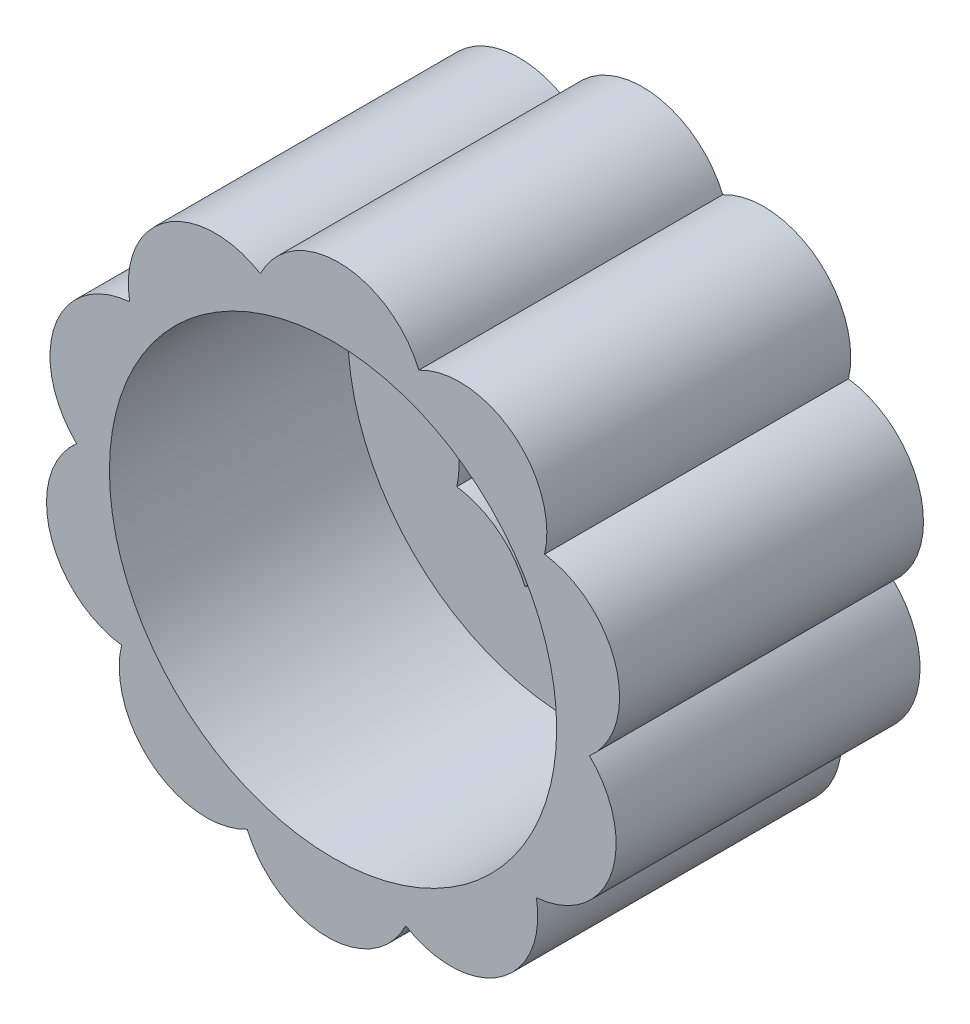
ISO-10303-21;
HEADER;
FILE_DESCRIPTION(('STEP AP214'),'2;1');
FILE_NAME('part.step','',(''),(''),'','','');
FILE_SCHEMA(('AUTOMOTIVE_DESIGN { 1 0 10303 214 1 1 1 1 }'));
ENDSEC;
DATA;
#1=APPLICATION_CONTEXT('core data for automotive mechanical design processes');
#2=APPLICATION_PROTOCOL_DEFINITION('international standard','automotive_design',2000,#1);
#3=PRODUCT_CONTEXT('',#1,'mechanical');
#4=PRODUCT('Part','Part','',(#3));
#5=PRODUCT_RELATED_PRODUCT_CATEGORY('part','',(#4));
#6=PRODUCT_DEFINITION_FORMATION('','',#4);
#7=PRODUCT_DEFINITION_CONTEXT('part definition',#1,'design');
#8=PRODUCT_DEFINITION('design','',#6,#7);
#9=PRODUCT_DEFINITION_SHAPE('','',#8);
#10=(LENGTH_UNIT() NAMED_UNIT(*) SI_UNIT(.MILLI.,.METRE.));
#11=(NAMED_UNIT(*) PLANE_ANGLE_UNIT() SI_UNIT($,.RADIAN.));
#12=(NAMED_UNIT(*) SI_UNIT($,.STERADIAN.) SOLID_ANGLE_UNIT());
#13=UNCERTAINTY_MEASURE_WITH_UNIT(LENGTH_MEASURE(1.E-05),#10,'distance_accuracy_value','');
#14=(GEOMETRIC_REPRESENTATION_CONTEXT(3) GLOBAL_UNCERTAINTY_ASSIGNED_CONTEXT((#13)) GLOBAL_UNIT_ASSIGNED_CONTEXT((#10,
#11,#12)) REPRESENTATION_CONTEXT('',''));
#15=CARTESIAN_POINT('',(0.,0.,0.));
#16=DIRECTION('',(0.,0.,1.));
#17=DIRECTION('',(1.,0.,0.));
#18=AXIS2_PLACEMENT_3D('',#15,#16,#17);
#19=CARTESIAN_POINT('',(18.9480103493997,53.3766191941579,87.));
#20=DIRECTION('',(0.,0.,1.));
#21=DIRECTION('',(1.,0.,0.));
#22=AXIS2_PLACEMENT_3D('',#19,#20,#21);
#23=PLANE('',#22);
#24=CARTESIAN_POINT('',(0.,0.,87.));
#25=DIRECTION('',(0.,0.,1.));
#26=DIRECTION('',(1.,0.,0.));
#27=AXIS2_PLACEMENT_3D('',#24,#25,#26);
#28=CIRCLE('',#27,64.0210741456216);
#29=CARTESIAN_POINT('',(64.0210741456216,0.,87.));
#30=VERTEX_POINT('',#29);
#31=EDGE_CURVE('E41',#30,#30,#28,.T.);
#32=ORIENTED_EDGE('',*,*,#31,.F.);
#33=EDGE_LOOP('',(#32));
#34=FACE_BOUND('',#33,.T.);
#35=CARTESIAN_POINT('',(36.2911252439045,47.2200374272145,87.));
#36=DIRECTION('',(0.,0.,1.));
#37=DIRECTION('',(1.,0.,0.));
#38=AXIS2_PLACEMENT_3D('',#35,#36,#37);
#39=CIRCLE('',#38,24.9163358273113);
#40=CARTESIAN_POINT('',(60.5533730327671,41.5484306627091,87.));
#41=VERTEX_POINT('',#40);
#42=CARTESIAN_POINT('',(24.5671530507992,69.2057661409653,87.));
#43=VERTEX_POINT('',#42);
#44=EDGE_CURVE('E211',#41,#43,#39,.T.);
#45=ORIENTED_EDGE('',*,*,#44,.T.);
#46=CARTESIAN_POINT('',(1.60489545489485,59.5332009611013,87.));
#47=DIRECTION('',(0.,0.,1.));
#48=DIRECTION('',(1.,0.,0.));
#49=AXIS2_PLACEMENT_3D('',#46,#47,#48);
#50=CIRCLE('',#49,24.9163358273119);
#51=CARTESIAN_POINT('',(-20.8028843897529,70.4288511708494,87.));
#52=VERTEX_POINT('',#51);
#53=EDGE_CURVE('E214',#43,#52,#50,.T.);
#54=ORIENTED_EDGE('',*,*,#53,.T.);
#55=CARTESIAN_POINT('',(-33.6943498494944,49.1067051869282,87.));
#56=DIRECTION('',(0.,0.,1.));
#57=DIRECTION('',(1.,0.,0.));
#58=AXIS2_PLACEMENT_3D('',#55,#56,#57);
#59=CIRCLE('',#58,24.9163358273113);
#60=CARTESIAN_POINT('',(-58.2269270574534,44.750508842078,87.));
#61=VERTEX_POINT('',#60);
#62=EDGE_CURVE('E217',#52,#61,#59,.T.);
#63=ORIENTED_EDGE('',*,*,#62,.T.);
#64=CARTESIAN_POINT('',(-56.1234987402054,19.9231171068684,87.));
#65=DIRECTION('',(0.,0.,1.));
#66=DIRECTION('',(1.,0.,0.));
#67=AXIS2_PLACEMENT_3D('',#64,#65,#66);
#68=CIRCLE('',#67,24.9163358273108);
#69=CARTESIAN_POINT('',(-73.4102626496661,1.97899314948605,87.));
#70=VERTEX_POINT('',#69);
#71=EDGE_CURVE('E219',#61,#70,#68,.T.);
#72=ORIENTED_EDGE('',*,*,#71,.T.);
#73=CARTESIAN_POINT('',(-57.115378679719,-16.8704245461701,87.));
#74=DIRECTION('',(0.,0.,1.));
#75=DIRECTION('',(1.,0.,0.));
#76=AXIS2_PLACEMENT_3D('',#73,#74,#75);
#77=CIRCLE('',#76,24.9163358273113);
#78=CARTESIAN_POINT('',(-60.5533730327643,-41.548430662706,87.));
#79=VERTEX_POINT('',#78);
#80=EDGE_CURVE('E221',#70,#79,#77,.T.);
#81=ORIENTED_EDGE('',*,*,#80,.T.);
#82=CARTESIAN_POINT('',(-36.2911252439003,-47.2200374272117,87.));
#83=DIRECTION('',(0.,0.,1.));
#84=DIRECTION('',(1.,0.,0.));
#85=AXIS2_PLACEMENT_3D('',#82,#83,#84);
#86=CIRCLE('',#85,24.916335827312);
#87=CARTESIAN_POINT('',(-24.5671530507942,-69.2057661409629,87.));
#88=VERTEX_POINT('',#87);
#89=EDGE_CURVE('E223',#79,#88,#86,.T.);
#90=ORIENTED_EDGE('',*,*,#89,.T.);
#91=CARTESIAN_POINT('',(-1.60489545489011,-59.5332009610999,87.));
#92=DIRECTION('',(0.,0.,1.));
#93=DIRECTION('',(1.,0.,0.));
#94=AXIS2_PLACEMENT_3D('',#91,#92,#93);
#95=CIRCLE('',#94,24.9163358273113);
#96=CARTESIAN_POINT('',(20.8028843897575,-70.4288511708468,87.));
#97=VERTEX_POINT('',#96);
#98=EDGE_CURVE('E225',#88,#97,#95,.T.);
#99=ORIENTED_EDGE('',*,*,#98,.T.);
#100=CARTESIAN_POINT('',(33.6943498494986,-49.1067051869254,87.));
#101=DIRECTION('',(0.,0.,1.));
#102=DIRECTION('',(1.,0.,0.));
#103=AXIS2_PLACEMENT_3D('',#100,#101,#102);
#104=CIRCLE('',#103,24.9163358273113);
#105=CARTESIAN_POINT('',(58.2269270574576,-44.7505088420751,87.));
#106=VERTEX_POINT('',#105);
#107=EDGE_CURVE('E227',#97,#106,#104,.T.);
#108=ORIENTED_EDGE('',*,*,#107,.T.);
#109=CARTESIAN_POINT('',(56.1234987402096,-19.9231171068656,87.));
#110=DIRECTION('',(0.,0.,1.));
#111=DIRECTION('',(1.,0.,0.));
#112=AXIS2_PLACEMENT_3D('',#109,#110,#111);
#113=CIRCLE('',#112,24.9163358273113);
#114=CARTESIAN_POINT('',(73.4102626496706,-1.97899314948295,87.));
#115=VERTEX_POINT('',#114);
#116=EDGE_CURVE('E229',#106,#115,#113,.T.);
#117=ORIENTED_EDGE('',*,*,#116,.T.);
#118=CARTESIAN_POINT('',(57.1153786797232,16.870424546173,87.));
#119=DIRECTION('',(0.,0.,1.));
#120=DIRECTION('',(1.,0.,0.));
#121=AXIS2_PLACEMENT_3D('',#118,#119,#120);
#122=CIRCLE('',#121,24.9163358273113);
#123=EDGE_CURVE('E231',#115,#41,#122,.T.);
#124=ORIENTED_EDGE('',*,*,#123,.T.);
#125=EDGE_LOOP('',(#45,#54,#63,#72,#81,#90,#99,#108,#117,#124));
#126=FACE_BOUND('',#125,.T.);
#127=ADVANCED_FACE('F37',(#34,#126),#23,.T.);
#128=CARTESIAN_POINT('',(18.9480103493997,53.3766191941579,0.));
#129=DIRECTION('',(0.,0.,1.));
#130=DIRECTION('',(1.,0.,0.));
#131=AXIS2_PLACEMENT_3D('',#128,#129,#130);
#132=PLANE('',#131);
#133=CARTESIAN_POINT('',(36.2911252439045,47.2200374272145,0.));
#134=DIRECTION('',(0.,0.,1.));
#135=DIRECTION('',(1.,0.,0.));
#136=AXIS2_PLACEMENT_3D('',#133,#134,#135);
#137=CIRCLE('',#136,24.9163358273113);
#138=CARTESIAN_POINT('',(60.5533730327671,41.5484306627091,0.));
#139=VERTEX_POINT('',#138);
#140=CARTESIAN_POINT('',(24.5671530507992,69.2057661409653,0.));
#141=VERTEX_POINT('',#140);
#142=EDGE_CURVE('E210',#139,#141,#137,.T.);
#143=ORIENTED_EDGE('',*,*,#142,.F.);
#144=CARTESIAN_POINT('',(57.1153786797232,16.870424546173,0.));
#145=DIRECTION('',(0.,0.,1.));
#146=DIRECTION('',(1.,0.,0.));
#147=AXIS2_PLACEMENT_3D('',#144,#145,#146);
#148=CIRCLE('',#147,24.9163358273113);
#149=CARTESIAN_POINT('',(73.4102626496706,-1.97899314948295,0.));
#150=VERTEX_POINT('',#149);
#151=EDGE_CURVE('E215',#150,#139,#148,.T.);
#152=ORIENTED_EDGE('',*,*,#151,.F.);
#153=CARTESIAN_POINT('',(56.1234987402096,-19.9231171068656,0.));
#154=DIRECTION('',(0.,0.,1.));
#155=DIRECTION('',(1.,0.,0.));
#156=AXIS2_PLACEMENT_3D('',#153,#154,#155);
#157=CIRCLE('',#156,24.9163358273113);
#158=CARTESIAN_POINT('',(58.2269270574576,-44.7505088420751,0.));
#159=VERTEX_POINT('',#158);
#160=EDGE_CURVE('E250',#159,#150,#157,.T.);
#161=ORIENTED_EDGE('',*,*,#160,.F.);
#162=CARTESIAN_POINT('',(33.6943498494986,-49.1067051869254,0.));
#163=DIRECTION('',(0.,0.,1.));
#164=DIRECTION('',(1.,0.,0.));
#165=AXIS2_PLACEMENT_3D('',#162,#163,#164);
#166=CIRCLE('',#165,24.9163358273113);
#167=CARTESIAN_POINT('',(20.8028843897575,-70.4288511708468,0.));
#168=VERTEX_POINT('',#167);
#169=EDGE_CURVE('E248',#168,#159,#166,.T.);
#170=ORIENTED_EDGE('',*,*,#169,.F.);
#171=CARTESIAN_POINT('',(-1.60489545489011,-59.5332009610999,0.));
#172=DIRECTION('',(0.,0.,1.));
#173=DIRECTION('',(1.,0.,0.));
#174=AXIS2_PLACEMENT_3D('',#171,#172,#173);
#175=CIRCLE('',#174,24.9163358273113);
#176=CARTESIAN_POINT('',(-24.5671530507942,-69.2057661409629,0.));
#177=VERTEX_POINT('',#176);
#178=EDGE_CURVE('E246',#177,#168,#175,.T.);
#179=ORIENTED_EDGE('',*,*,#178,.F.);
#180=CARTESIAN_POINT('',(-36.2911252439003,-47.2200374272117,0.));
#181=DIRECTION('',(0.,0.,1.));
#182=DIRECTION('',(1.,0.,0.));
#183=AXIS2_PLACEMENT_3D('',#180,#181,#182);
#184=CIRCLE('',#183,24.916335827312);
#185=CARTESIAN_POINT('',(-60.5533730327643,-41.548430662706,0.));
#186=VERTEX_POINT('',#185);
#187=EDGE_CURVE('E244',#186,#177,#184,.T.);
#188=ORIENTED_EDGE('',*,*,#187,.F.);
#189=CARTESIAN_POINT('',(-57.115378679719,-16.8704245461701,0.));
#190=DIRECTION('',(0.,0.,1.));
#191=DIRECTION('',(1.,0.,0.));
#192=AXIS2_PLACEMENT_3D('',#189,#190,#191);
#193=CIRCLE('',#192,24.9163358273113);
#194=CARTESIAN_POINT('',(-73.4102626496661,1.97899314948605,0.));
#195=VERTEX_POINT('',#194);
#196=EDGE_CURVE('E242',#195,#186,#193,.T.);
#197=ORIENTED_EDGE('',*,*,#196,.F.);
#198=CARTESIAN_POINT('',(-56.1234987402054,19.9231171068684,0.));
#199=DIRECTION('',(0.,0.,1.));
#200=DIRECTION('',(1.,0.,0.));
#201=AXIS2_PLACEMENT_3D('',#198,#199,#200);
#202=CIRCLE('',#201,24.9163358273108);
#203=CARTESIAN_POINT('',(-58.2269270574534,44.750508842078,0.));
#204=VERTEX_POINT('',#203);
#205=EDGE_CURVE('E240',#204,#195,#202,.T.);
#206=ORIENTED_EDGE('',*,*,#205,.F.);
#207=CARTESIAN_POINT('',(-33.6943498494944,49.1067051869282,0.));
#208=DIRECTION('',(0.,0.,1.));
#209=DIRECTION('',(1.,0.,0.));
#210=AXIS2_PLACEMENT_3D('',#207,#208,#209);
#211=CIRCLE('',#210,24.9163358273113);
#212=CARTESIAN_POINT('',(-20.8028843897529,70.4288511708494,0.));
#213=VERTEX_POINT('',#212);
#214=EDGE_CURVE('E238',#213,#204,#211,.T.);
#215=ORIENTED_EDGE('',*,*,#214,.F.);
#216=CARTESIAN_POINT('',(1.60489545489485,59.5332009611013,0.));
#217=DIRECTION('',(0.,0.,1.));
#218=DIRECTION('',(1.,0.,0.));
#219=AXIS2_PLACEMENT_3D('',#216,#217,#218);
#220=CIRCLE('',#219,24.9163358273119);
#221=EDGE_CURVE('E236',#141,#213,#220,.T.);
#222=ORIENTED_EDGE('',*,*,#221,.F.);
#223=EDGE_LOOP('',(#143,#152,#161,#170,#179,#188,#197,#206,#215,#222));
#224=FACE_BOUND('',#223,.T.);
#225=CARTESIAN_POINT('',(-33.6943498494944,49.1067051869282,0.));
#226=DIRECTION('',(0.,0.,-1.));
#227=DIRECTION('',(1.,0.,0.));
#228=AXIS2_PLACEMENT_3D('',#225,#226,#227);
#229=CIRCLE('',#228,24.9163358273104);
#230=CARTESIAN_POINT('',(-11.2865700048479,38.2110549771827,0.));
#231=VERTEX_POINT('',#230);
#232=CARTESIAN_POINT('',(-31.5909215322469,24.2793134517185,0.));
#233=VERTEX_POINT('',#232);
#234=EDGE_CURVE('E561',#231,#233,#229,.T.);
#235=ORIENTED_EDGE('',*,*,#234,.T.);
#236=CARTESIAN_POINT('',(-56.1234987402054,19.9231171068684,0.));
#237=DIRECTION('',(0.,0.,-1.));
#238=DIRECTION('',(1.,0.,0.));
#239=AXIS2_PLACEMENT_3D('',#236,#237,#238);
#240=CIRCLE('',#239,24.9163358273108);
#241=CARTESIAN_POINT('',(-39.8286147702587,1.07369941121305,0.));
#242=VERTEX_POINT('',#241);
#243=EDGE_CURVE('E564',#233,#242,#240,.T.);
#244=ORIENTED_EDGE('',*,*,#243,.T.);
#245=CARTESIAN_POINT('',(-57.115378679719,-16.8704245461701,0.));
#246=DIRECTION('',(0.,0.,-1.));
#247=DIRECTION('',(1.,0.,0.));
#248=AXIS2_PLACEMENT_3D('',#245,#246,#247);
#249=CIRCLE('',#248,24.9163358273113);
#250=CARTESIAN_POINT('',(-32.8531308908561,-22.5420313106749,0.));
#251=VERTEX_POINT('',#250);
#252=EDGE_CURVE('E567',#242,#251,#249,.T.);
#253=ORIENTED_EDGE('',*,*,#252,.T.);
#254=CARTESIAN_POINT('',(-36.2911252439003,-47.2200374272117,0.));
#255=DIRECTION('',(0.,0.,-1.));
#256=DIRECTION('',(1.,0.,0.));
#257=AXIS2_PLACEMENT_3D('',#254,#255,#256);
#258=CIRCLE('',#257,24.916335827312);
#259=CARTESIAN_POINT('',(-13.3288676479959,-37.5474722473493,0.));
#260=VERTEX_POINT('',#259);
#261=EDGE_CURVE('E570',#251,#260,#258,.T.);
#262=ORIENTED_EDGE('',*,*,#261,.T.);
#263=CARTESIAN_POINT('',(-1.60489545489011,-59.5332009610999,0.));
#264=DIRECTION('',(0.,0.,-1.));
#265=DIRECTION('',(1.,0.,0.));
#266=AXIS2_PLACEMENT_3D('',#263,#264,#265);
#267=CIRCLE('',#266,24.9163358273113);
#268=CARTESIAN_POINT('',(11.286570004851,-38.2110549771785,0.));
#269=VERTEX_POINT('',#268);
#270=EDGE_CURVE('E573',#260,#269,#267,.T.);
#271=ORIENTED_EDGE('',*,*,#270,.T.);
#272=CARTESIAN_POINT('',(33.6943498494986,-49.1067051869254,0.));
#273=DIRECTION('',(0.,0.,-1.));
#274=DIRECTION('',(1.,0.,0.));
#275=AXIS2_PLACEMENT_3D('',#272,#273,#274);
#276=CIRCLE('',#275,24.9163358273113);
#277=CARTESIAN_POINT('',(31.5909215322506,-24.2793134517158,0.));
#278=VERTEX_POINT('',#277);
#279=EDGE_CURVE('E576',#269,#278,#276,.T.);
#280=ORIENTED_EDGE('',*,*,#279,.T.);
#281=CARTESIAN_POINT('',(56.1234987402096,-19.9231171068656,0.));
#282=DIRECTION('',(0.,0.,-1.));
#283=DIRECTION('',(1.,0.,0.));
#284=AXIS2_PLACEMENT_3D('',#281,#282,#283);
#285=CIRCLE('',#284,24.9163358273113);
#286=CARTESIAN_POINT('',(39.8286147702623,-1.07369941120962,0.));
#287=VERTEX_POINT('',#286);
#288=EDGE_CURVE('E579',#278,#287,#285,.T.);
#289=ORIENTED_EDGE('',*,*,#288,.T.);
#290=CARTESIAN_POINT('',(57.1153786797232,16.870424546173,0.));
#291=DIRECTION('',(0.,0.,-1.));
#292=DIRECTION('',(1.,0.,0.));
#293=AXIS2_PLACEMENT_3D('',#290,#291,#292);
#294=CIRCLE('',#293,24.9163358273113);
#295=CARTESIAN_POINT('',(32.8531308908605,22.5420313106779,0.));
#296=VERTEX_POINT('',#295);
#297=EDGE_CURVE('E582',#287,#296,#294,.T.);
#298=ORIENTED_EDGE('',*,*,#297,.T.);
#299=CARTESIAN_POINT('',(36.2911252439045,47.2200374272145,0.));
#300=DIRECTION('',(0.,0.,-1.));
#301=DIRECTION('',(1.,0.,0.));
#302=AXIS2_PLACEMENT_3D('',#299,#300,#301);
#303=CIRCLE('',#302,24.9163358273117);
#304=CARTESIAN_POINT('',(13.3288676479992,37.5474722473518,0.));
#305=VERTEX_POINT('',#304);
#306=EDGE_CURVE('E585',#296,#305,#303,.T.);
#307=ORIENTED_EDGE('',*,*,#306,.T.);
#308=CARTESIAN_POINT('',(1.60489545489485,59.5332009611013,0.));
#309=DIRECTION('',(0.,0.,-1.));
#310=DIRECTION('',(1.,0.,0.));
#311=AXIS2_PLACEMENT_3D('',#308,#309,#310);
#312=CIRCLE('',#311,24.9163358273096);
#313=EDGE_CURVE('E189',#305,#231,#312,.T.);
#314=ORIENTED_EDGE('',*,*,#313,.T.);
#315=EDGE_LOOP('',(#235,#244,#253,#262,#271,#280,#289,#298,#307,#314));
#316=FACE_BOUND('',#315,.T.);
#317=ADVANCED_FACE('F290',(#224,#316),#132,.F.);
#318=CARTESIAN_POINT('',(36.2911252439045,47.2200374272145,87.));
#319=DIRECTION('',(0.,0.,-1.));
#320=DIRECTION('',(-1.,0.,0.));
#321=AXIS2_PLACEMENT_3D('',#318,#319,#320);
#322=CYLINDRICAL_SURFACE('',#321,24.9163358273113);
#323=ORIENTED_EDGE('',*,*,#142,.T.);
#324=DIRECTION('',(0.,0.,-1.));
#325=VECTOR('',#324,1.);
#326=CARTESIAN_POINT('',(24.5671530507992,69.2057661409653,87.));
#327=LINE('',#326,#325);
#328=EDGE_CURVE('E46',#43,#141,#327,.T.);
#329=ORIENTED_EDGE('',*,*,#328,.F.);
#330=ORIENTED_EDGE('',*,*,#44,.F.);
#331=DIRECTION('',(0.,0.,-1.));
#332=VECTOR('',#331,1.);
#333=CARTESIAN_POINT('',(60.5533730327671,41.5484306627091,87.));
#334=LINE('',#333,#332);
#335=EDGE_CURVE('E233',#41,#139,#334,.T.);
#336=ORIENTED_EDGE('',*,*,#335,.T.);
#337=EDGE_LOOP('',(#323,#329,#330,#336));
#338=FACE_BOUND('',#337,.T.);
#339=ADVANCED_FACE('F39',(#338),#322,.T.);
#340=CARTESIAN_POINT('',(1.60489545489485,59.5332009611013,87.));
#341=DIRECTION('',(0.,0.,-1.));
#342=DIRECTION('',(-1.,0.,0.));
#343=AXIS2_PLACEMENT_3D('',#340,#341,#342);
#344=CYLINDRICAL_SURFACE('',#343,24.9163358273119);
#345=ORIENTED_EDGE('',*,*,#221,.T.);
#346=DIRECTION('',(0.,0.,-1.));
#347=VECTOR('',#346,1.);
#348=CARTESIAN_POINT('',(-20.8028843897529,70.4288511708494,87.));
#349=LINE('',#348,#347);
#350=EDGE_CURVE('E276',#52,#213,#349,.T.);
#351=ORIENTED_EDGE('',*,*,#350,.F.);
#352=ORIENTED_EDGE('',*,*,#53,.F.);
#353=ORIENTED_EDGE('',*,*,#328,.T.);
#354=EDGE_LOOP('',(#345,#351,#352,#353));
#355=FACE_BOUND('',#354,.T.);
#356=ADVANCED_FACE('F282',(#355),#344,.T.);
#357=CARTESIAN_POINT('',(-33.6943498494944,49.1067051869282,87.));
#358=DIRECTION('',(0.,0.,-1.));
#359=DIRECTION('',(-1.,0.,0.));
#360=AXIS2_PLACEMENT_3D('',#357,#358,#359);
#361=CYLINDRICAL_SURFACE('',#360,24.9163358273113);
#362=ORIENTED_EDGE('',*,*,#214,.T.);
#363=DIRECTION('',(0.,0.,-1.));
#364=VECTOR('',#363,1.);
#365=CARTESIAN_POINT('',(-58.2269270574534,44.750508842078,87.));
#366=LINE('',#365,#364);
#367=EDGE_CURVE('E273',#61,#204,#366,.T.);
#368=ORIENTED_EDGE('',*,*,#367,.F.);
#369=ORIENTED_EDGE('',*,*,#62,.F.);
#370=ORIENTED_EDGE('',*,*,#350,.T.);
#371=EDGE_LOOP('',(#362,#368,#369,#370));
#372=FACE_BOUND('',#371,.T.);
#373=ADVANCED_FACE('F298',(#372),#361,.T.);
#374=CARTESIAN_POINT('',(-56.1234987402054,19.9231171068684,87.));
#375=DIRECTION('',(0.,0.,-1.));
#376=DIRECTION('',(-1.,0.,0.));
#377=AXIS2_PLACEMENT_3D('',#374,#375,#376);
#378=CYLINDRICAL_SURFACE('',#377,24.9163358273108);
#379=ORIENTED_EDGE('',*,*,#205,.T.);
#380=DIRECTION('',(0.,0.,-1.));
#381=VECTOR('',#380,1.);
#382=CARTESIAN_POINT('',(-73.4102626496661,1.97899314948605,87.));
#383=LINE('',#382,#381);
#384=EDGE_CURVE('E270',#70,#195,#383,.T.);
#385=ORIENTED_EDGE('',*,*,#384,.F.);
#386=ORIENTED_EDGE('',*,*,#71,.F.);
#387=ORIENTED_EDGE('',*,*,#367,.T.);
#388=EDGE_LOOP('',(#379,#385,#386,#387));
#389=FACE_BOUND('',#388,.T.);
#390=ADVANCED_FACE('F302',(#389),#378,.T.);
#391=CARTESIAN_POINT('',(-57.115378679719,-16.8704245461701,87.));
#392=DIRECTION('',(0.,0.,-1.));
#393=DIRECTION('',(-1.,0.,0.));
#394=AXIS2_PLACEMENT_3D('',#391,#392,#393);
#395=CYLINDRICAL_SURFACE('',#394,24.9163358273113);
#396=ORIENTED_EDGE('',*,*,#196,.T.);
#397=DIRECTION('',(0.,0.,-1.));
#398=VECTOR('',#397,1.);
#399=CARTESIAN_POINT('',(-60.5533730327643,-41.548430662706,87.));
#400=LINE('',#399,#398);
#401=EDGE_CURVE('E267',#79,#186,#400,.T.);
#402=ORIENTED_EDGE('',*,*,#401,.F.);
#403=ORIENTED_EDGE('',*,*,#80,.F.);
#404=ORIENTED_EDGE('',*,*,#384,.T.);
#405=EDGE_LOOP('',(#396,#402,#403,#404));
#406=FACE_BOUND('',#405,.T.);
#407=ADVANCED_FACE('F330',(#406),#395,.T.);
#408=CARTESIAN_POINT('',(-36.2911252439003,-47.2200374272117,87.));
#409=DIRECTION('',(0.,0.,-1.));
#410=DIRECTION('',(-1.,0.,0.));
#411=AXIS2_PLACEMENT_3D('',#408,#409,#410);
#412=CYLINDRICAL_SURFACE('',#411,24.916335827312);
#413=ORIENTED_EDGE('',*,*,#187,.T.);
#414=DIRECTION('',(0.,0.,-1.));
#415=VECTOR('',#414,1.);
#416=CARTESIAN_POINT('',(-24.5671530507942,-69.2057661409629,87.));
#417=LINE('',#416,#415);
#418=EDGE_CURVE('E264',#88,#177,#417,.T.);
#419=ORIENTED_EDGE('',*,*,#418,.F.);
#420=ORIENTED_EDGE('',*,*,#89,.F.);
#421=ORIENTED_EDGE('',*,*,#401,.T.);
#422=EDGE_LOOP('',(#413,#419,#420,#421));
#423=FACE_BOUND('',#422,.T.);
#424=ADVANCED_FACE('F328',(#423),#412,.T.);
#425=CARTESIAN_POINT('',(-1.60489545489011,-59.5332009610999,87.));
#426=DIRECTION('',(0.,0.,-1.));
#427=DIRECTION('',(-1.,0.,0.));
#428=AXIS2_PLACEMENT_3D('',#425,#426,#427);
#429=CYLINDRICAL_SURFACE('',#428,24.9163358273113);
#430=ORIENTED_EDGE('',*,*,#178,.T.);
#431=DIRECTION('',(0.,0.,-1.));
#432=VECTOR('',#431,1.);
#433=CARTESIAN_POINT('',(20.8028843897575,-70.4288511708468,87.));
#434=LINE('',#433,#432);
#435=EDGE_CURVE('E261',#97,#168,#434,.T.);
#436=ORIENTED_EDGE('',*,*,#435,.F.);
#437=ORIENTED_EDGE('',*,*,#98,.F.);
#438=ORIENTED_EDGE('',*,*,#418,.T.);
#439=EDGE_LOOP('',(#430,#436,#437,#438));
#440=FACE_BOUND('',#439,.T.);
#441=ADVANCED_FACE('F324',(#440),#429,.T.);
#442=CARTESIAN_POINT('',(33.6943498494986,-49.1067051869254,87.));
#443=DIRECTION('',(0.,0.,-1.));
#444=DIRECTION('',(-1.,0.,0.));
#445=AXIS2_PLACEMENT_3D('',#442,#443,#444);
#446=CYLINDRICAL_SURFACE('',#445,24.9163358273113);
#447=ORIENTED_EDGE('',*,*,#169,.T.);
#448=DIRECTION('',(0.,0.,-1.));
#449=VECTOR('',#448,1.);
#450=CARTESIAN_POINT('',(58.2269270574576,-44.7505088420751,87.));
#451=LINE('',#450,#449);
#452=EDGE_CURVE('E258',#106,#159,#451,.T.);
#453=ORIENTED_EDGE('',*,*,#452,.F.);
#454=ORIENTED_EDGE('',*,*,#107,.F.);
#455=ORIENTED_EDGE('',*,*,#435,.T.);
#456=EDGE_LOOP('',(#447,#453,#454,#455));
#457=FACE_BOUND('',#456,.T.);
#458=ADVANCED_FACE('F319',(#457),#446,.T.);
#459=CARTESIAN_POINT('',(56.1234987402096,-19.9231171068656,87.));
#460=DIRECTION('',(0.,0.,-1.));
#461=DIRECTION('',(-1.,0.,0.));
#462=AXIS2_PLACEMENT_3D('',#459,#460,#461);
#463=CYLINDRICAL_SURFACE('',#462,24.9163358273113);
#464=ORIENTED_EDGE('',*,*,#160,.T.);
#465=DIRECTION('',(0.,0.,-1.));
#466=VECTOR('',#465,1.);
#467=CARTESIAN_POINT('',(73.4102626496706,-1.97899314948295,87.));
#468=LINE('',#467,#466);
#469=EDGE_CURVE('E255',#115,#150,#468,.T.);
#470=ORIENTED_EDGE('',*,*,#469,.F.);
#471=ORIENTED_EDGE('',*,*,#116,.F.);
#472=ORIENTED_EDGE('',*,*,#452,.T.);
#473=EDGE_LOOP('',(#464,#470,#471,#472));
#474=FACE_BOUND('',#473,.T.);
#475=ADVANCED_FACE('F313',(#474),#463,.T.);
#476=CARTESIAN_POINT('',(57.1153786797232,16.870424546173,87.));
#477=DIRECTION('',(0.,0.,-1.));
#478=DIRECTION('',(-1.,0.,0.));
#479=AXIS2_PLACEMENT_3D('',#476,#477,#478);
#480=CYLINDRICAL_SURFACE('',#479,24.9163358273113);
#481=ORIENTED_EDGE('',*,*,#151,.T.);
#482=ORIENTED_EDGE('',*,*,#335,.F.);
#483=ORIENTED_EDGE('',*,*,#123,.F.);
#484=ORIENTED_EDGE('',*,*,#469,.T.);
#485=EDGE_LOOP('',(#481,#482,#483,#484));
#486=FACE_BOUND('',#485,.T.);
#487=ADVANCED_FACE('F311',(#486),#480,.T.);
#488=CARTESIAN_POINT('',(-33.6943498494944,49.1067051869282,87.));
#489=DIRECTION('',(0.,0.,-1.));
#490=DIRECTION('',(-1.,0.,0.));
#491=AXIS2_PLACEMENT_3D('',#488,#489,#490);
#492=CYLINDRICAL_SURFACE('',#491,24.9163358273104);
#493=CARTESIAN_POINT('',(-33.6943498494944,49.1067051869282,18.7261685030549));
#494=DIRECTION('',(0.,0.,-1.));
#495=DIRECTION('',(-1.,0.,0.));
#496=AXIS2_PLACEMENT_3D('',#493,#494,#495);
#497=CIRCLE('',#496,24.9163358273104);
#498=CARTESIAN_POINT('',(-31.5909215322469,24.2793134517185,18.7261685030549));
#499=VERTEX_POINT('',#498);
#500=CARTESIAN_POINT('',(-11.2865700048479,38.2110549771827,18.7261685030549));
#501=VERTEX_POINT('',#500);
#502=EDGE_CURVE('E52',#499,#501,#497,.F.);
#503=ORIENTED_EDGE('',*,*,#502,.F.);
#504=DIRECTION('',(0.,0.,-1.));
#505=VECTOR('',#504,1.);
#506=CARTESIAN_POINT('',(-31.5909215322469,24.2793134517185,87.));
#507=LINE('',#506,#505);
#508=EDGE_CURVE('E208',#499,#233,#507,.T.);
#509=ORIENTED_EDGE('',*,*,#508,.T.);
#510=ORIENTED_EDGE('',*,*,#234,.F.);
#511=DIRECTION('',(0.,0.,-1.));
#512=VECTOR('',#511,1.);
#513=CARTESIAN_POINT('',(-11.2865700048479,38.2110549771827,87.));
#514=LINE('',#513,#512);
#515=EDGE_CURVE('E59',#501,#231,#514,.T.);
#516=ORIENTED_EDGE('',*,*,#515,.F.);
#517=EDGE_LOOP('',(#503,#509,#510,#516));
#518=FACE_BOUND('',#517,.T.);
#519=ADVANCED_FACE('F348',(#518),#492,.T.);
#520=CARTESIAN_POINT('',(-56.1234987402054,19.9231171068684,87.));
#521=DIRECTION('',(0.,0.,-1.));
#522=DIRECTION('',(-1.,0.,0.));
#523=AXIS2_PLACEMENT_3D('',#520,#521,#522);
#524=CYLINDRICAL_SURFACE('',#523,24.9163358273108);
#525=CARTESIAN_POINT('',(-56.1234987402054,19.9231171068684,18.7261685030549));
#526=DIRECTION('',(0.,0.,-1.));
#527=DIRECTION('',(-1.,0.,0.));
#528=AXIS2_PLACEMENT_3D('',#525,#526,#527);
#529=CIRCLE('',#528,24.9163358273108);
#530=CARTESIAN_POINT('',(-39.8286147702587,1.07369941121305,18.7261685030549));
#531=VERTEX_POINT('',#530);
#532=EDGE_CURVE('E558',#531,#499,#529,.F.);
#533=ORIENTED_EDGE('',*,*,#532,.F.);
#534=DIRECTION('',(0.,0.,-1.));
#535=VECTOR('',#534,1.);
#536=CARTESIAN_POINT('',(-39.8286147702587,1.07369941121305,87.));
#537=LINE('',#536,#535);
#538=EDGE_CURVE('E206',#531,#242,#537,.T.);
#539=ORIENTED_EDGE('',*,*,#538,.T.);
#540=ORIENTED_EDGE('',*,*,#243,.F.);
#541=ORIENTED_EDGE('',*,*,#508,.F.);
#542=EDGE_LOOP('',(#533,#539,#540,#541));
#543=FACE_BOUND('',#542,.T.);
#544=ADVANCED_FACE('F380',(#543),#524,.T.);
#545=CARTESIAN_POINT('',(-57.115378679719,-16.8704245461701,87.));
#546=DIRECTION('',(0.,0.,-1.));
#547=DIRECTION('',(-1.,0.,0.));
#548=AXIS2_PLACEMENT_3D('',#545,#546,#547);
#549=CYLINDRICAL_SURFACE('',#548,24.9163358273113);
#550=CARTESIAN_POINT('',(-57.115378679719,-16.8704245461701,18.7261685030549));
#551=DIRECTION('',(0.,0.,-1.));
#552=DIRECTION('',(-1.,0.,0.));
#553=AXIS2_PLACEMENT_3D('',#550,#551,#552);
#554=CIRCLE('',#553,24.9163358273113);
#555=CARTESIAN_POINT('',(-32.8531308908561,-22.5420313106749,18.7261685030549));
#556=VERTEX_POINT('',#555);
#557=EDGE_CURVE('E556',#556,#531,#554,.F.);
#558=ORIENTED_EDGE('',*,*,#557,.F.);
#559=DIRECTION('',(0.,0.,-1.));
#560=VECTOR('',#559,1.);
#561=CARTESIAN_POINT('',(-32.8531308908561,-22.5420313106749,87.));
#562=LINE('',#561,#560);
#563=EDGE_CURVE('E204',#556,#251,#562,.T.);
#564=ORIENTED_EDGE('',*,*,#563,.T.);
#565=ORIENTED_EDGE('',*,*,#252,.F.);
#566=ORIENTED_EDGE('',*,*,#538,.F.);
#567=EDGE_LOOP('',(#558,#564,#565,#566));
#568=FACE_BOUND('',#567,.T.);
#569=ADVANCED_FACE('F387',(#568),#549,.T.);
#570=CARTESIAN_POINT('',(-36.2911252439003,-47.2200374272117,87.));
#571=DIRECTION('',(0.,0.,-1.));
#572=DIRECTION('',(-1.,0.,0.));
#573=AXIS2_PLACEMENT_3D('',#570,#571,#572);
#574=CYLINDRICAL_SURFACE('',#573,24.916335827312);
#575=CARTESIAN_POINT('',(-36.2911252439003,-47.2200374272117,18.7261685030549));
#576=DIRECTION('',(0.,0.,-1.));
#577=DIRECTION('',(-1.,0.,0.));
#578=AXIS2_PLACEMENT_3D('',#575,#576,#577);
#579=CIRCLE('',#578,24.916335827312);
#580=CARTESIAN_POINT('',(-13.3288676479959,-37.5474722473493,18.7261685030549));
#581=VERTEX_POINT('',#580);
#582=EDGE_CURVE('E554',#581,#556,#579,.F.);
#583=ORIENTED_EDGE('',*,*,#582,.F.);
#584=DIRECTION('',(0.,0.,-1.));
#585=VECTOR('',#584,1.);
#586=CARTESIAN_POINT('',(-13.3288676479959,-37.5474722473493,87.));
#587=LINE('',#586,#585);
#588=EDGE_CURVE('E202',#581,#260,#587,.T.);
#589=ORIENTED_EDGE('',*,*,#588,.T.);
#590=ORIENTED_EDGE('',*,*,#261,.F.);
#591=ORIENTED_EDGE('',*,*,#563,.F.);
#592=EDGE_LOOP('',(#583,#589,#590,#591));
#593=FACE_BOUND('',#592,.T.);
#594=ADVANCED_FACE('F394',(#593),#574,.T.);
#595=CARTESIAN_POINT('',(-1.60489545489011,-59.5332009610999,87.));
#596=DIRECTION('',(0.,0.,-1.));
#597=DIRECTION('',(-1.,0.,0.));
#598=AXIS2_PLACEMENT_3D('',#595,#596,#597);
#599=CYLINDRICAL_SURFACE('',#598,24.9163358273113);
#600=CARTESIAN_POINT('',(-1.60489545489011,-59.5332009610999,18.7261685030549));
#601=DIRECTION('',(0.,0.,-1.));
#602=DIRECTION('',(-1.,0.,0.));
#603=AXIS2_PLACEMENT_3D('',#600,#601,#602);
#604=CIRCLE('',#603,24.9163358273113);
#605=CARTESIAN_POINT('',(11.286570004851,-38.2110549771785,18.7261685030549));
#606=VERTEX_POINT('',#605);
#607=EDGE_CURVE('E552',#606,#581,#604,.F.);
#608=ORIENTED_EDGE('',*,*,#607,.F.);
#609=DIRECTION('',(0.,0.,-1.));
#610=VECTOR('',#609,1.);
#611=CARTESIAN_POINT('',(11.286570004851,-38.2110549771785,87.));
#612=LINE('',#611,#610);
#613=EDGE_CURVE('E200',#606,#269,#612,.T.);
#614=ORIENTED_EDGE('',*,*,#613,.T.);
#615=ORIENTED_EDGE('',*,*,#270,.F.);
#616=ORIENTED_EDGE('',*,*,#588,.F.);
#617=EDGE_LOOP('',(#608,#614,#615,#616));
#618=FACE_BOUND('',#617,.T.);
#619=ADVANCED_FACE('F402',(#618),#599,.T.);
#620=CARTESIAN_POINT('',(33.6943498494986,-49.1067051869254,87.));
#621=DIRECTION('',(0.,0.,-1.));
#622=DIRECTION('',(-1.,0.,0.));
#623=AXIS2_PLACEMENT_3D('',#620,#621,#622);
#624=CYLINDRICAL_SURFACE('',#623,24.9163358273113);
#625=CARTESIAN_POINT('',(33.6943498494986,-49.1067051869254,18.7261685030549));
#626=DIRECTION('',(0.,0.,-1.));
#627=DIRECTION('',(-1.,0.,0.));
#628=AXIS2_PLACEMENT_3D('',#625,#626,#627);
#629=CIRCLE('',#628,24.9163358273113);
#630=CARTESIAN_POINT('',(31.5909215322506,-24.2793134517158,18.7261685030549));
#631=VERTEX_POINT('',#630);
#632=EDGE_CURVE('E550',#631,#606,#629,.F.);
#633=ORIENTED_EDGE('',*,*,#632,.F.);
#634=DIRECTION('',(0.,0.,-1.));
#635=VECTOR('',#634,1.);
#636=CARTESIAN_POINT('',(31.5909215322506,-24.2793134517158,87.));
#637=LINE('',#636,#635);
#638=EDGE_CURVE('E198',#631,#278,#637,.T.);
#639=ORIENTED_EDGE('',*,*,#638,.T.);
#640=ORIENTED_EDGE('',*,*,#279,.F.);
#641=ORIENTED_EDGE('',*,*,#613,.F.);
#642=EDGE_LOOP('',(#633,#639,#640,#641));
#643=FACE_BOUND('',#642,.T.);
#644=ADVANCED_FACE('F410',(#643),#624,.T.);
#645=CARTESIAN_POINT('',(56.1234987402096,-19.9231171068656,87.));
#646=DIRECTION('',(0.,0.,-1.));
#647=DIRECTION('',(-1.,0.,0.));
#648=AXIS2_PLACEMENT_3D('',#645,#646,#647);
#649=CYLINDRICAL_SURFACE('',#648,24.9163358273113);
#650=CARTESIAN_POINT('',(56.1234987402096,-19.9231171068656,18.7261685030549));
#651=DIRECTION('',(0.,0.,-1.));
#652=DIRECTION('',(-1.,0.,0.));
#653=AXIS2_PLACEMENT_3D('',#650,#651,#652);
#654=CIRCLE('',#653,24.9163358273113);
#655=CARTESIAN_POINT('',(39.8286147702623,-1.07369941120963,18.7261685030549));
#656=VERTEX_POINT('',#655);
#657=EDGE_CURVE('E548',#656,#631,#654,.F.);
#658=ORIENTED_EDGE('',*,*,#657,.F.);
#659=DIRECTION('',(0.,0.,-1.));
#660=VECTOR('',#659,1.);
#661=CARTESIAN_POINT('',(39.8286147702623,-1.07369941120962,87.));
#662=LINE('',#661,#660);
#663=EDGE_CURVE('E192',#656,#287,#662,.T.);
#664=ORIENTED_EDGE('',*,*,#663,.T.);
#665=ORIENTED_EDGE('',*,*,#288,.F.);
#666=ORIENTED_EDGE('',*,*,#638,.F.);
#667=EDGE_LOOP('',(#658,#664,#665,#666));
#668=FACE_BOUND('',#667,.T.);
#669=ADVANCED_FACE('F418',(#668),#649,.T.);
#670=CARTESIAN_POINT('',(57.1153786797232,16.870424546173,87.));
#671=DIRECTION('',(0.,0.,-1.));
#672=DIRECTION('',(-1.,0.,0.));
#673=AXIS2_PLACEMENT_3D('',#670,#671,#672);
#674=CYLINDRICAL_SURFACE('',#673,24.9163358273113);
#675=CARTESIAN_POINT('',(57.1153786797232,16.870424546173,18.7261685030549));
#676=DIRECTION('',(0.,0.,-1.));
#677=DIRECTION('',(-1.,0.,0.));
#678=AXIS2_PLACEMENT_3D('',#675,#676,#677);
#679=CIRCLE('',#678,24.9163358273113);
#680=CARTESIAN_POINT('',(32.8531308908605,22.5420313106779,18.7261685030549));
#681=VERTEX_POINT('',#680);
#682=EDGE_CURVE('E184',#681,#656,#679,.F.);
#683=ORIENTED_EDGE('',*,*,#682,.F.);
#684=DIRECTION('',(0.,0.,-1.));
#685=VECTOR('',#684,1.);
#686=CARTESIAN_POINT('',(32.8531308908605,22.5420313106779,87.));
#687=LINE('',#686,#685);
#688=EDGE_CURVE('E183',#681,#296,#687,.T.);
#689=ORIENTED_EDGE('',*,*,#688,.T.);
#690=ORIENTED_EDGE('',*,*,#297,.F.);
#691=ORIENTED_EDGE('',*,*,#663,.F.);
#692=EDGE_LOOP('',(#683,#689,#690,#691));
#693=FACE_BOUND('',#692,.T.);
#694=ADVANCED_FACE('F426',(#693),#674,.T.);
#695=CARTESIAN_POINT('',(36.2911252439045,47.2200374272145,87.));
#696=DIRECTION('',(0.,0.,-1.));
#697=DIRECTION('',(-1.,0.,0.));
#698=AXIS2_PLACEMENT_3D('',#695,#696,#697);
#699=CYLINDRICAL_SURFACE('',#698,24.9163358273117);
#700=CARTESIAN_POINT('',(36.2911252439045,47.2200374272145,18.7261685030549));
#701=DIRECTION('',(0.,0.,-1.));
#702=DIRECTION('',(-1.,0.,0.));
#703=AXIS2_PLACEMENT_3D('',#700,#701,#702);
#704=CIRCLE('',#703,24.9163358273117);
#705=CARTESIAN_POINT('',(13.3288676479992,37.5474722473518,18.7261685030549));
#706=VERTEX_POINT('',#705);
#707=EDGE_CURVE('E175',#706,#681,#704,.F.);
#708=ORIENTED_EDGE('',*,*,#707,.F.);
#709=DIRECTION('',(0.,0.,-1.));
#710=VECTOR('',#709,1.);
#711=CARTESIAN_POINT('',(13.3288676479992,37.5474722473518,87.));
#712=LINE('',#711,#710);
#713=EDGE_CURVE('E182',#706,#305,#712,.T.);
#714=ORIENTED_EDGE('',*,*,#713,.T.);
#715=ORIENTED_EDGE('',*,*,#306,.F.);
#716=ORIENTED_EDGE('',*,*,#688,.F.);
#717=EDGE_LOOP('',(#708,#714,#715,#716));
#718=FACE_BOUND('',#717,.T.);
#719=ADVANCED_FACE('F180',(#718),#699,.T.);
#720=CARTESIAN_POINT('',(1.60489545489485,59.5332009611013,87.));
#721=DIRECTION('',(0.,0.,-1.));
#722=DIRECTION('',(-1.,0.,0.));
#723=AXIS2_PLACEMENT_3D('',#720,#721,#722);
#724=CYLINDRICAL_SURFACE('',#723,24.9163358273096);
#725=CARTESIAN_POINT('',(1.60489545489485,59.5332009611013,18.7261685030549));
#726=DIRECTION('',(0.,0.,-1.));
#727=DIRECTION('',(-1.,0.,0.));
#728=AXIS2_PLACEMENT_3D('',#725,#726,#727);
#729=CIRCLE('',#728,24.9163358273096);
#730=EDGE_CURVE('E11',#501,#706,#729,.F.);
#731=ORIENTED_EDGE('',*,*,#730,.F.);
#732=ORIENTED_EDGE('',*,*,#515,.T.);
#733=ORIENTED_EDGE('',*,*,#313,.F.);
#734=ORIENTED_EDGE('',*,*,#713,.F.);
#735=EDGE_LOOP('',(#731,#732,#733,#734));
#736=FACE_BOUND('',#735,.T.);
#737=ADVANCED_FACE('F187',(#736),#724,.T.);
#738=CARTESIAN_POINT('',(0.,0.,0.));
#739=DIRECTION('',(0.,0.,-1.));
#740=DIRECTION('',(-1.,0.,0.));
#741=AXIS2_PLACEMENT_3D('',#738,#739,#740);
#742=CYLINDRICAL_SURFACE('',#741,64.0210741456216);
#743=ORIENTED_EDGE('',*,*,#31,.T.);
#744=EDGE_LOOP('',(#743));
#745=FACE_BOUND('',#744,.T.);
#746=CARTESIAN_POINT('',(0.,0.,18.7261685030549));
#747=DIRECTION('',(0.,0.,-1.));
#748=DIRECTION('',(-1.,0.,0.));
#749=AXIS2_PLACEMENT_3D('',#746,#747,#748);
#750=CIRCLE('',#749,64.0210741456216);
#751=CARTESIAN_POINT('',(-64.0210741456216,0.,18.7261685030549));
#752=VERTEX_POINT('',#751);
#753=EDGE_CURVE('E185',#752,#752,#750,.T.);
#754=ORIENTED_EDGE('',*,*,#753,.T.);
#755=EDGE_LOOP('',(#754));
#756=FACE_BOUND('',#755,.T.);
#757=ADVANCED_FACE('F447',(#745,#756),#742,.F.);
#758=CARTESIAN_POINT('',(-64.0210741456216,0.,18.7261685030549));
#759=DIRECTION('',(0.,0.,-1.));
#760=DIRECTION('',(-1.,0.,0.));
#761=AXIS2_PLACEMENT_3D('',#758,#759,#760);
#762=PLANE('',#761);
#763=ORIENTED_EDGE('',*,*,#502,.T.);
#764=ORIENTED_EDGE('',*,*,#730,.T.);
#765=ORIENTED_EDGE('',*,*,#707,.T.);
#766=ORIENTED_EDGE('',*,*,#682,.T.);
#767=ORIENTED_EDGE('',*,*,#657,.T.);
#768=ORIENTED_EDGE('',*,*,#632,.T.);
#769=ORIENTED_EDGE('',*,*,#607,.T.);
#770=ORIENTED_EDGE('',*,*,#582,.T.);
#771=ORIENTED_EDGE('',*,*,#557,.T.);
#772=ORIENTED_EDGE('',*,*,#532,.T.);
#773=EDGE_LOOP('',(#763,#764,#765,#766,#767,#768,#769,#770,#771,#772));
#774=FACE_BOUND('',#773,.T.);
#775=ORIENTED_EDGE('',*,*,#753,.F.);
#776=EDGE_LOOP('',(#775));
#777=FACE_BOUND('',#776,.T.);
#778=ADVANCED_FACE('F173',(#774,#777),#762,.F.);
#779=CLOSED_SHELL('',(#127,#317,#339,#356,#373,#390,#407,#424,#441,#458,#475,#487,#519,#544,
#569,#594,#619,#644,#669,#694,#719,#737,#757,#778));
#780=MANIFOLD_SOLID_BREP('B2',#779);
#781=ADVANCED_BREP_SHAPE_REPRESENTATION('',(#18,#780),#14);
#782=SHAPE_DEFINITION_REPRESENTATION(#9,#781);
ENDSEC;
END-ISO-10303-21;
